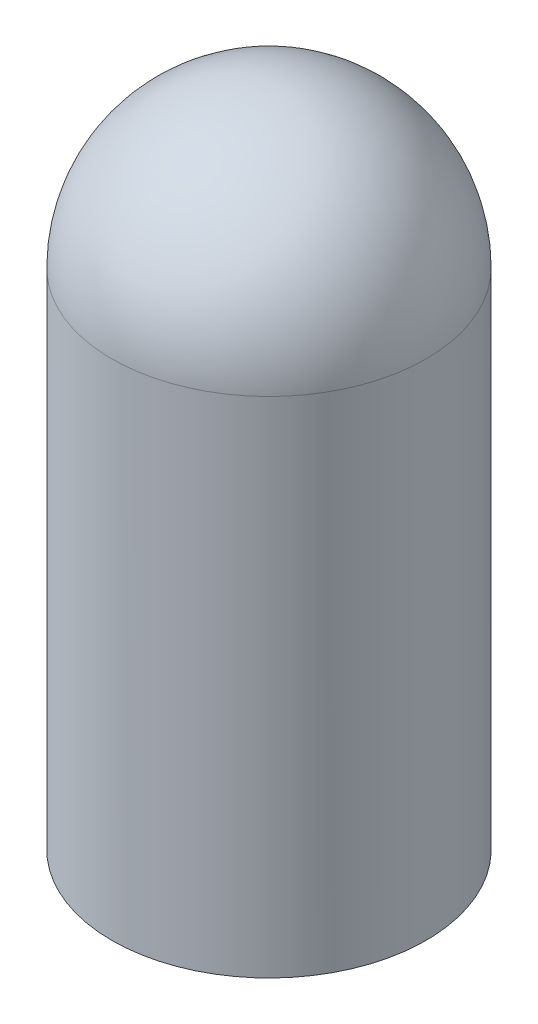
ISO-10303-21;
HEADER;
FILE_DESCRIPTION(('STEP AP214'),'2;1');
FILE_NAME('part.step','',(''),(''),'','','');
FILE_SCHEMA(('AUTOMOTIVE_DESIGN { 1 0 10303 214 1 1 1 1 }'));
ENDSEC;
DATA;
#1=APPLICATION_CONTEXT('core data for automotive mechanical design processes');
#2=APPLICATION_PROTOCOL_DEFINITION('international standard','automotive_design',2000,#1);
#3=PRODUCT_CONTEXT('',#1,'mechanical');
#4=PRODUCT('Part','Part','',(#3));
#5=PRODUCT_RELATED_PRODUCT_CATEGORY('part','',(#4));
#6=PRODUCT_DEFINITION_FORMATION('','',#4);
#7=PRODUCT_DEFINITION_CONTEXT('part definition',#1,'design');
#8=PRODUCT_DEFINITION('design','',#6,#7);
#9=PRODUCT_DEFINITION_SHAPE('','',#8);
#10=(LENGTH_UNIT() NAMED_UNIT(*) SI_UNIT(.MILLI.,.METRE.));
#11=(NAMED_UNIT(*) PLANE_ANGLE_UNIT() SI_UNIT($,.RADIAN.));
#12=(NAMED_UNIT(*) SI_UNIT($,.STERADIAN.) SOLID_ANGLE_UNIT());
#13=UNCERTAINTY_MEASURE_WITH_UNIT(LENGTH_MEASURE(1.E-05),#10,'distance_accuracy_value','');
#14=(GEOMETRIC_REPRESENTATION_CONTEXT(3) GLOBAL_UNCERTAINTY_ASSIGNED_CONTEXT((#13)) GLOBAL_UNIT_ASSIGNED_CONTEXT((#10,
#11,#12)) REPRESENTATION_CONTEXT('',''));
#15=CARTESIAN_POINT('',(0.,0.,0.));
#16=DIRECTION('',(0.,0.,1.));
#17=DIRECTION('',(1.,0.,0.));
#18=AXIS2_PLACEMENT_3D('',#15,#16,#17);
#19=CARTESIAN_POINT('',(9.75,0.,0.));
#20=DIRECTION('',(0.,-1.,0.));
#21=DIRECTION('',(0.,0.,-1.));
#22=AXIS2_PLACEMENT_3D('',#19,#20,#21);
#23=PLANE('',#22);
#24=CARTESIAN_POINT('',(0.,0.,0.));
#25=DIRECTION('',(0.,-1.,0.));
#26=DIRECTION('',(0.,0.,-1.));
#27=AXIS2_PLACEMENT_3D('',#24,#25,#26);
#28=CIRCLE('',#27,9.25);
#29=CARTESIAN_POINT('',(0.,0.,-9.25));
#30=VERTEX_POINT('',#29);
#31=EDGE_CURVE('E41',#30,#30,#28,.T.);
#32=ORIENTED_EDGE('',*,*,#31,.F.);
#33=EDGE_LOOP('',(#32));
#34=FACE_BOUND('',#33,.T.);
#35=CARTESIAN_POINT('',(0.,0.,0.));
#36=DIRECTION('',(0.,-1.,0.));
#37=DIRECTION('',(0.,0.,-1.));
#38=AXIS2_PLACEMENT_3D('',#35,#36,#37);
#39=CIRCLE('',#38,9.75);
#40=CARTESIAN_POINT('',(0.,0.,-9.75));
#41=VERTEX_POINT('',#40);
#42=EDGE_CURVE('E10',#41,#41,#39,.T.);
#43=ORIENTED_EDGE('',*,*,#42,.T.);
#44=EDGE_LOOP('',(#43));
#45=FACE_BOUND('',#44,.T.);
#46=ADVANCED_FACE('F31',(#34,#45),#23,.T.);
#47=CARTESIAN_POINT('',(0.,0.,0.));
#48=DIRECTION('',(0.,-1.,0.));
#49=DIRECTION('',(0.,0.,-1.));
#50=AXIS2_PLACEMENT_3D('',#47,#48,#49);
#51=CYLINDRICAL_SURFACE('',#50,9.75);
#52=CARTESIAN_POINT('',(0.,31.25,0.));
#53=DIRECTION('',(0.,-1.,0.));
#54=DIRECTION('',(0.,0.,-1.));
#55=AXIS2_PLACEMENT_3D('',#52,#53,#54);
#56=CIRCLE('',#55,9.75);
#57=CARTESIAN_POINT('',(0.,31.25,-9.75));
#58=VERTEX_POINT('',#57);
#59=EDGE_CURVE('E37',#58,#58,#56,.T.);
#60=ORIENTED_EDGE('',*,*,#59,.T.);
#61=EDGE_LOOP('',(#60));
#62=FACE_BOUND('',#61,.T.);
#63=ORIENTED_EDGE('',*,*,#42,.F.);
#64=EDGE_LOOP('',(#63));
#65=FACE_BOUND('',#64,.T.);
#66=ADVANCED_FACE('F61',(#62,#65),#51,.T.);
#67=CARTESIAN_POINT('',(0.,31.25,0.));
#68=DIRECTION('',(0.,-1.,0.));
#69=DIRECTION('',(1.,0.,0.));
#70=AXIS2_PLACEMENT_3D('',#67,#68,#69);
#71=SPHERICAL_SURFACE('',#70,9.75);
#72=ORIENTED_EDGE('',*,*,#59,.F.);
#73=EDGE_LOOP('',(#72));
#74=FACE_BOUND('',#73,.T.);
#75=ADVANCED_FACE('F56',(#74),#71,.T.);
#76=CARTESIAN_POINT('',(0.,0.,0.));
#77=DIRECTION('',(0.,-1.,0.));
#78=DIRECTION('',(0.,0.,-1.));
#79=AXIS2_PLACEMENT_3D('',#76,#77,#78);
#80=CYLINDRICAL_SURFACE('',#79,9.25);
#81=CARTESIAN_POINT('',(0.,31.25,0.));
#82=DIRECTION('',(0.,-1.,0.));
#83=DIRECTION('',(0.,0.,-1.));
#84=AXIS2_PLACEMENT_3D('',#81,#82,#83);
#85=CIRCLE('',#84,9.25);
#86=CARTESIAN_POINT('',(0.,31.25,-9.25));
#87=VERTEX_POINT('',#86);
#88=EDGE_CURVE('E45',#87,#87,#85,.T.);
#89=ORIENTED_EDGE('',*,*,#88,.F.);
#90=EDGE_LOOP('',(#89));
#91=FACE_BOUND('',#90,.T.);
#92=ORIENTED_EDGE('',*,*,#31,.T.);
#93=EDGE_LOOP('',(#92));
#94=FACE_BOUND('',#93,.T.);
#95=ADVANCED_FACE('F53',(#91,#94),#80,.F.);
#96=CARTESIAN_POINT('',(0.,31.25,0.));
#97=DIRECTION('',(0.,-1.,0.));
#98=DIRECTION('',(1.,0.,0.));
#99=AXIS2_PLACEMENT_3D('',#96,#97,#98);
#100=SPHERICAL_SURFACE('',#99,9.25);
#101=ORIENTED_EDGE('',*,*,#88,.T.);
#102=EDGE_LOOP('',(#101));
#103=FACE_BOUND('',#102,.T.);
#104=ADVANCED_FACE('F51',(#103),#100,.F.);
#105=CLOSED_SHELL('',(#46,#66,#75,#95,#104));
#106=MANIFOLD_SOLID_BREP('B2',#105);
#107=ADVANCED_BREP_SHAPE_REPRESENTATION('',(#18,#106),#14);
#108=SHAPE_DEFINITION_REPRESENTATION(#9,#107);
ENDSEC;
END-ISO-10303-21;
